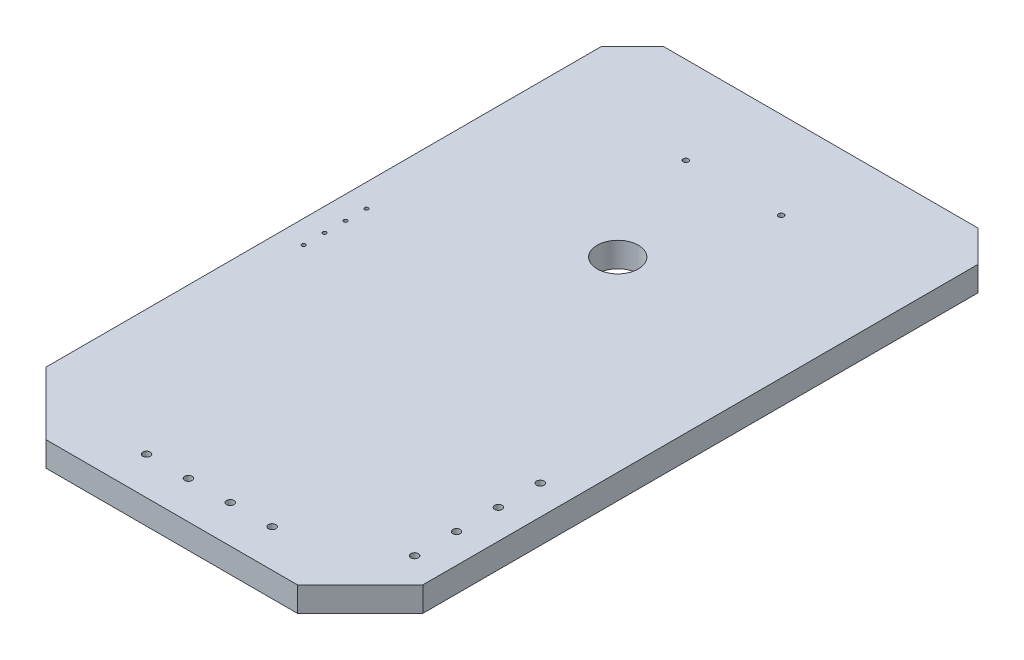
ISO-10303-21;
HEADER;
FILE_DESCRIPTION(('STEP AP214'),'2;1');
FILE_NAME('part.step','',(''),(''),'','','');
FILE_SCHEMA(('AUTOMOTIVE_DESIGN { 1 0 10303 214 1 1 1 1 }'));
ENDSEC;
DATA;
#1=APPLICATION_CONTEXT('core data for automotive mechanical design processes');
#2=APPLICATION_PROTOCOL_DEFINITION('international standard','automotive_design',2000,#1);
#3=PRODUCT_CONTEXT('',#1,'mechanical');
#4=PRODUCT('Part','Part','',(#3));
#5=PRODUCT_RELATED_PRODUCT_CATEGORY('part','',(#4));
#6=PRODUCT_DEFINITION_FORMATION('','',#4);
#7=PRODUCT_DEFINITION_CONTEXT('part definition',#1,'design');
#8=PRODUCT_DEFINITION('design','',#6,#7);
#9=PRODUCT_DEFINITION_SHAPE('','',#8);
#10=(LENGTH_UNIT() NAMED_UNIT(*) SI_UNIT(.MILLI.,.METRE.));
#11=(NAMED_UNIT(*) PLANE_ANGLE_UNIT() SI_UNIT($,.RADIAN.));
#12=(NAMED_UNIT(*) SI_UNIT($,.STERADIAN.) SOLID_ANGLE_UNIT());
#13=UNCERTAINTY_MEASURE_WITH_UNIT(LENGTH_MEASURE(1.E-05),#10,'distance_accuracy_value','');
#14=(GEOMETRIC_REPRESENTATION_CONTEXT(3) GLOBAL_UNCERTAINTY_ASSIGNED_CONTEXT((#13)) GLOBAL_UNIT_ASSIGNED_CONTEXT((#10,
#11,#12)) REPRESENTATION_CONTEXT('',''));
#15=CARTESIAN_POINT('',(0.,0.,0.));
#16=DIRECTION('',(0.,0.,1.));
#17=DIRECTION('',(1.,0.,0.));
#18=AXIS2_PLACEMENT_3D('',#15,#16,#17);
#19=CARTESIAN_POINT('',(0.,1.5,0.));
#20=DIRECTION('',(0.,1.,0.));
#21=DIRECTION('',(0.,0.,1.));
#22=AXIS2_PLACEMENT_3D('',#19,#20,#21);
#23=PLANE('',#22);
#24=CARTESIAN_POINT('',(129.667,1.5,-82.804));
#25=DIRECTION('',(0.,1.,0.));
#26=DIRECTION('',(0.,0.,1.));
#27=AXIS2_PLACEMENT_3D('',#24,#25,#26);
#28=CIRCLE('',#27,1.25000000000001);
#29=CARTESIAN_POINT('',(129.667,1.5,-81.554));
#30=VERTEX_POINT('',#29);
#31=EDGE_CURVE('E266',#30,#30,#28,.T.);
#32=ORIENTED_EDGE('',*,*,#31,.F.);
#33=EDGE_LOOP('',(#32));
#34=FACE_BOUND('',#33,.T.);
#35=CARTESIAN_POINT('',(119.507,1.5,-73.914));
#36=DIRECTION('',(0.,1.,0.));
#37=DIRECTION('',(0.,0.,1.));
#38=AXIS2_PLACEMENT_3D('',#35,#36,#37);
#39=CIRCLE('',#38,0.112496600000012);
#40=CARTESIAN_POINT('',(119.507,1.5,-73.8015034));
#41=VERTEX_POINT('',#40);
#42=EDGE_CURVE('E251',#41,#41,#39,.T.);
#43=ORIENTED_EDGE('',*,*,#42,.F.);
#44=EDGE_LOOP('',(#43));
#45=FACE_BOUND('',#44,.T.);
#46=CARTESIAN_POINT('',(119.507,1.5,-77.724));
#47=DIRECTION('',(0.,1.,0.));
#48=DIRECTION('',(0.,0.,1.));
#49=AXIS2_PLACEMENT_3D('',#46,#47,#48);
#50=CIRCLE('',#49,0.112496600000012);
#51=CARTESIAN_POINT('',(119.507,1.5,-77.6115034));
#52=VERTEX_POINT('',#51);
#53=EDGE_CURVE('E239',#52,#52,#50,.T.);
#54=ORIENTED_EDGE('',*,*,#53,.F.);
#55=EDGE_LOOP('',(#54));
#56=FACE_BOUND('',#55,.T.);
#57=CARTESIAN_POINT('',(139.192,1.5,-63.5));
#58=DIRECTION('',(0.,1.,0.));
#59=DIRECTION('',(0.,0.,1.));
#60=AXIS2_PLACEMENT_3D('',#57,#58,#59);
#61=CIRCLE('',#60,0.224993199999968);
#62=CARTESIAN_POINT('',(139.192,1.5,-63.2750068));
#63=VERTEX_POINT('',#62);
#64=EDGE_CURVE('E227',#63,#63,#61,.T.);
#65=ORIENTED_EDGE('',*,*,#64,.F.);
#66=EDGE_LOOP('',(#65));
#67=FACE_BOUND('',#66,.T.);
#68=CARTESIAN_POINT('',(139.192,1.5,-68.58));
#69=DIRECTION('',(0.,1.,0.));
#70=DIRECTION('',(0.,0.,1.));
#71=AXIS2_PLACEMENT_3D('',#68,#69,#70);
#72=CIRCLE('',#71,0.224993199999968);
#73=CARTESIAN_POINT('',(139.192,1.5,-68.3550068));
#74=VERTEX_POINT('',#73);
#75=EDGE_CURVE('E215',#74,#74,#72,.T.);
#76=ORIENTED_EDGE('',*,*,#75,.F.);
#77=EDGE_LOOP('',(#76));
#78=FACE_BOUND('',#77,.T.);
#79=CARTESIAN_POINT('',(128.27,1.5,-58.166));
#80=DIRECTION('',(0.,1.,0.));
#81=DIRECTION('',(0.,0.,1.));
#82=AXIS2_PLACEMENT_3D('',#79,#80,#81);
#83=CIRCLE('',#82,0.224993199999995);
#84=CARTESIAN_POINT('',(128.27,1.5,-57.9410068));
#85=VERTEX_POINT('',#84);
#86=EDGE_CURVE('E203',#85,#85,#83,.T.);
#87=ORIENTED_EDGE('',*,*,#86,.F.);
#88=EDGE_LOOP('',(#87));
#89=FACE_BOUND('',#88,.T.);
#90=CARTESIAN_POINT('',(133.35,1.5,-58.166));
#91=DIRECTION('',(0.,1.,0.));
#92=DIRECTION('',(0.,0.,1.));
#93=AXIS2_PLACEMENT_3D('',#90,#91,#92);
#94=CIRCLE('',#93,0.224993199999995);
#95=CARTESIAN_POINT('',(133.35,1.5,-57.9410068));
#96=VERTEX_POINT('',#95);
#97=EDGE_CURVE('E191',#96,#96,#94,.T.);
#98=ORIENTED_EDGE('',*,*,#97,.F.);
#99=EDGE_LOOP('',(#98));
#100=FACE_BOUND('',#99,.T.);
#101=CARTESIAN_POINT('',(126.65202,1.5,-89.94902));
#102=DIRECTION('',(0.,1.,0.));
#103=DIRECTION('',(0.,0.,1.));
#104=AXIS2_PLACEMENT_3D('',#101,#102,#103);
#105=CIRCLE('',#104,0.162509199999994);
#106=CARTESIAN_POINT('',(126.65202,1.5,-89.7865108));
#107=VERTEX_POINT('',#106);
#108=EDGE_CURVE('E137',#107,#107,#105,.T.);
#109=ORIENTED_EDGE('',*,*,#108,.F.);
#110=EDGE_LOOP('',(#109));
#111=FACE_BOUND('',#110,.T.);
#112=DIRECTION('',(-0.707106781186545,0.,0.70710678118655));
#113=VECTOR('',#112,1.);
#114=CARTESIAN_POINT('',(120.015,1.5,-95.25));
#115=LINE('',#114,#113);
#116=CARTESIAN_POINT('',(120.015,1.5,-95.25));
#117=VERTEX_POINT('',#116);
#118=CARTESIAN_POINT('',(118.11,1.5,-93.345));
#119=VERTEX_POINT('',#118);
#120=EDGE_CURVE('E148',#117,#119,#115,.T.);
#121=ORIENTED_EDGE('',*,*,#120,.T.);
#122=DIRECTION('',(0.,0.,1.));
#123=VECTOR('',#122,1.);
#124=CARTESIAN_POINT('',(118.11,1.5,-59.69));
#125=LINE('',#124,#123);
#126=CARTESIAN_POINT('',(118.11,1.5,-59.69));
#127=VERTEX_POINT('',#126);
#128=EDGE_CURVE('E96',#119,#127,#125,.T.);
#129=ORIENTED_EDGE('',*,*,#128,.T.);
#130=DIRECTION('',(0.707106781186546,0.,0.707106781186549));
#131=VECTOR('',#130,1.);
#132=CARTESIAN_POINT('',(118.11,1.5,-59.69));
#133=LINE('',#132,#131);
#134=CARTESIAN_POINT('',(121.92,1.5,-55.88));
#135=VERTEX_POINT('',#134);
#136=EDGE_CURVE('E163',#127,#135,#133,.T.);
#137=ORIENTED_EDGE('',*,*,#136,.T.);
#138=DIRECTION('',(1.,0.,0.));
#139=VECTOR('',#138,1.);
#140=CARTESIAN_POINT('',(121.92,1.5,-55.88));
#141=LINE('',#140,#139);
#142=CARTESIAN_POINT('',(137.16,1.5,-55.88));
#143=VERTEX_POINT('',#142);
#144=EDGE_CURVE('E176',#135,#143,#141,.T.);
#145=ORIENTED_EDGE('',*,*,#144,.T.);
#146=DIRECTION('',(0.707106781186546,0.,-0.707106781186549));
#147=VECTOR('',#146,1.);
#148=CARTESIAN_POINT('',(137.16,1.5,-55.88));
#149=LINE('',#148,#147);
#150=CARTESIAN_POINT('',(140.97,1.5,-59.69));
#151=VERTEX_POINT('',#150);
#152=EDGE_CURVE('E115',#143,#151,#149,.T.);
#153=ORIENTED_EDGE('',*,*,#152,.T.);
#154=DIRECTION('',(0.,0.,-1.));
#155=VECTOR('',#154,1.);
#156=CARTESIAN_POINT('',(140.97,1.5,-59.69));
#157=LINE('',#156,#155);
#158=CARTESIAN_POINT('',(140.97,1.5,-93.345));
#159=VERTEX_POINT('',#158);
#160=EDGE_CURVE('E109',#151,#159,#157,.T.);
#161=ORIENTED_EDGE('',*,*,#160,.T.);
#162=DIRECTION('',(-0.707106781186545,0.,-0.70710678118655));
#163=VECTOR('',#162,1.);
#164=CARTESIAN_POINT('',(139.065,1.5,-95.25));
#165=LINE('',#164,#163);
#166=CARTESIAN_POINT('',(139.065,1.5,-95.25));
#167=VERTEX_POINT('',#166);
#168=EDGE_CURVE('E113',#159,#167,#165,.T.);
#169=ORIENTED_EDGE('',*,*,#168,.T.);
#170=DIRECTION('',(-1.,0.,0.));
#171=VECTOR('',#170,1.);
#172=CARTESIAN_POINT('',(139.065,1.5,-95.25));
#173=LINE('',#172,#171);
#174=EDGE_CURVE('E53',#167,#117,#173,.T.);
#175=ORIENTED_EDGE('',*,*,#174,.T.);
#176=EDGE_LOOP('',(#121,#129,#137,#145,#153,#161,#169,#175));
#177=FACE_BOUND('',#176,.T.);
#178=CARTESIAN_POINT('',(132.42798,1.5,-89.94902));
#179=DIRECTION('',(0.,1.,0.));
#180=DIRECTION('',(0.,0.,1.));
#181=AXIS2_PLACEMENT_3D('',#178,#179,#180);
#182=CIRCLE('',#181,0.162509199999994);
#183=CARTESIAN_POINT('',(132.42798,1.5,-89.7865108));
#184=VERTEX_POINT('',#183);
#185=EDGE_CURVE('E185',#184,#184,#182,.T.);
#186=ORIENTED_EDGE('',*,*,#185,.F.);
#187=EDGE_LOOP('',(#186));
#188=FACE_BOUND('',#187,.T.);
#189=CARTESIAN_POINT('',(130.81,1.5,-58.166));
#190=DIRECTION('',(0.,1.,0.));
#191=DIRECTION('',(0.,0.,1.));
#192=AXIS2_PLACEMENT_3D('',#189,#190,#191);
#193=CIRCLE('',#192,0.224993199999995);
#194=CARTESIAN_POINT('',(130.81,1.5,-57.9410068));
#195=VERTEX_POINT('',#194);
#196=EDGE_CURVE('E197',#195,#195,#193,.T.);
#197=ORIENTED_EDGE('',*,*,#196,.F.);
#198=EDGE_LOOP('',(#197));
#199=FACE_BOUND('',#198,.T.);
#200=CARTESIAN_POINT('',(125.73,1.5,-58.166));
#201=DIRECTION('',(0.,1.,0.));
#202=DIRECTION('',(0.,0.,1.));
#203=AXIS2_PLACEMENT_3D('',#200,#201,#202);
#204=CIRCLE('',#203,0.224993200000023);
#205=CARTESIAN_POINT('',(125.73,1.5,-57.9410068));
#206=VERTEX_POINT('',#205);
#207=EDGE_CURVE('E209',#206,#206,#204,.T.);
#208=ORIENTED_EDGE('',*,*,#207,.F.);
#209=EDGE_LOOP('',(#208));
#210=FACE_BOUND('',#209,.T.);
#211=CARTESIAN_POINT('',(139.192,1.5,-66.04));
#212=DIRECTION('',(0.,1.,0.));
#213=DIRECTION('',(0.,0.,1.));
#214=AXIS2_PLACEMENT_3D('',#211,#212,#213);
#215=CIRCLE('',#214,0.224993199999968);
#216=CARTESIAN_POINT('',(139.192,1.5,-65.8150068));
#217=VERTEX_POINT('',#216);
#218=EDGE_CURVE('E221',#217,#217,#215,.T.);
#219=ORIENTED_EDGE('',*,*,#218,.F.);
#220=EDGE_LOOP('',(#219));
#221=FACE_BOUND('',#220,.T.);
#222=CARTESIAN_POINT('',(139.192,1.5,-60.96));
#223=DIRECTION('',(0.,1.,0.));
#224=DIRECTION('',(0.,0.,1.));
#225=AXIS2_PLACEMENT_3D('',#222,#223,#224);
#226=CIRCLE('',#225,0.224993199999968);
#227=CARTESIAN_POINT('',(139.192,1.5,-60.7350068));
#228=VERTEX_POINT('',#227);
#229=EDGE_CURVE('E233',#228,#228,#226,.T.);
#230=ORIENTED_EDGE('',*,*,#229,.F.);
#231=EDGE_LOOP('',(#230));
#232=FACE_BOUND('',#231,.T.);
#233=CARTESIAN_POINT('',(119.507,1.5,-76.454));
#234=DIRECTION('',(0.,1.,0.));
#235=DIRECTION('',(0.,0.,1.));
#236=AXIS2_PLACEMENT_3D('',#233,#234,#235);
#237=CIRCLE('',#236,0.112496600000012);
#238=CARTESIAN_POINT('',(119.507,1.5,-76.3415034));
#239=VERTEX_POINT('',#238);
#240=EDGE_CURVE('E245',#239,#239,#237,.T.);
#241=ORIENTED_EDGE('',*,*,#240,.F.);
#242=EDGE_LOOP('',(#241));
#243=FACE_BOUND('',#242,.T.);
#244=CARTESIAN_POINT('',(119.507,1.5,-75.184));
#245=DIRECTION('',(0.,1.,0.));
#246=DIRECTION('',(0.,0.,1.));
#247=AXIS2_PLACEMENT_3D('',#244,#245,#246);
#248=CIRCLE('',#247,0.112496600000012);
#249=CARTESIAN_POINT('',(119.507,1.5,-75.0715034));
#250=VERTEX_POINT('',#249);
#251=EDGE_CURVE('E257',#250,#250,#248,.T.);
#252=ORIENTED_EDGE('',*,*,#251,.F.);
#253=EDGE_LOOP('',(#252));
#254=FACE_BOUND('',#253,.T.);
#255=ADVANCED_FACE('F36',(#34,#45,#56,#67,#78,#89,#100,#111,#177,#188,#199,#210,#221,#232,#243,
#254),#23,.T.);
#256=CARTESIAN_POINT('',(0.,0.,0.));
#257=DIRECTION('',(0.,1.,0.));
#258=DIRECTION('',(0.,0.,1.));
#259=AXIS2_PLACEMENT_3D('',#256,#257,#258);
#260=PLANE('',#259);
#261=CARTESIAN_POINT('',(129.667,0.,-82.804));
#262=DIRECTION('',(0.,1.,0.));
#263=DIRECTION('',(0.,0.,1.));
#264=AXIS2_PLACEMENT_3D('',#261,#262,#263);
#265=CIRCLE('',#264,1.25000000000001);
#266=CARTESIAN_POINT('',(129.667,0.,-81.554));
#267=VERTEX_POINT('',#266);
#268=EDGE_CURVE('E263',#267,#267,#265,.T.);
#269=ORIENTED_EDGE('',*,*,#268,.T.);
#270=EDGE_LOOP('',(#269));
#271=FACE_BOUND('',#270,.T.);
#272=DIRECTION('',(-0.707106781186545,0.,0.70710678118655));
#273=VECTOR('',#272,1.);
#274=CARTESIAN_POINT('',(120.015,0.,-95.25));
#275=LINE('',#274,#273);
#276=CARTESIAN_POINT('',(120.015,0.,-95.25));
#277=VERTEX_POINT('',#276);
#278=CARTESIAN_POINT('',(118.11,0.,-93.345));
#279=VERTEX_POINT('',#278);
#280=EDGE_CURVE('E133',#277,#279,#275,.T.);
#281=ORIENTED_EDGE('',*,*,#280,.F.);
#282=DIRECTION('',(-1.,0.,0.));
#283=VECTOR('',#282,1.);
#284=CARTESIAN_POINT('',(139.065,0.,-95.25));
#285=LINE('',#284,#283);
#286=CARTESIAN_POINT('',(139.065,0.,-95.25));
#287=VERTEX_POINT('',#286);
#288=EDGE_CURVE('E88',#287,#277,#285,.T.);
#289=ORIENTED_EDGE('',*,*,#288,.F.);
#290=DIRECTION('',(-0.707106781186545,0.,-0.70710678118655));
#291=VECTOR('',#290,1.);
#292=CARTESIAN_POINT('',(139.065,0.,-95.25));
#293=LINE('',#292,#291);
#294=CARTESIAN_POINT('',(140.97,0.,-93.345));
#295=VERTEX_POINT('',#294);
#296=EDGE_CURVE('E82',#295,#287,#293,.T.);
#297=ORIENTED_EDGE('',*,*,#296,.F.);
#298=DIRECTION('',(0.,0.,-1.));
#299=VECTOR('',#298,1.);
#300=CARTESIAN_POINT('',(140.97,0.,-59.69));
#301=LINE('',#300,#299);
#302=CARTESIAN_POINT('',(140.97,0.,-59.69));
#303=VERTEX_POINT('',#302);
#304=EDGE_CURVE('E123',#303,#295,#301,.T.);
#305=ORIENTED_EDGE('',*,*,#304,.F.);
#306=DIRECTION('',(0.707106781186546,0.,-0.707106781186549));
#307=VECTOR('',#306,1.);
#308=CARTESIAN_POINT('',(137.16,0.,-55.88));
#309=LINE('',#308,#307);
#310=CARTESIAN_POINT('',(137.16,0.,-55.88));
#311=VERTEX_POINT('',#310);
#312=EDGE_CURVE('E143',#311,#303,#309,.T.);
#313=ORIENTED_EDGE('',*,*,#312,.F.);
#314=DIRECTION('',(1.,0.,0.));
#315=VECTOR('',#314,1.);
#316=CARTESIAN_POINT('',(121.92,0.,-55.88));
#317=LINE('',#316,#315);
#318=CARTESIAN_POINT('',(121.92,0.,-55.88));
#319=VERTEX_POINT('',#318);
#320=EDGE_CURVE('E141',#319,#311,#317,.T.);
#321=ORIENTED_EDGE('',*,*,#320,.F.);
#322=DIRECTION('',(0.707106781186546,0.,0.707106781186549));
#323=VECTOR('',#322,1.);
#324=CARTESIAN_POINT('',(118.11,0.,-59.69));
#325=LINE('',#324,#323);
#326=CARTESIAN_POINT('',(118.11,0.,-59.69));
#327=VERTEX_POINT('',#326);
#328=EDGE_CURVE('E139',#327,#319,#325,.T.);
#329=ORIENTED_EDGE('',*,*,#328,.F.);
#330=DIRECTION('',(0.,0.,1.));
#331=VECTOR('',#330,1.);
#332=CARTESIAN_POINT('',(118.11,0.,-59.69));
#333=LINE('',#332,#331);
#334=EDGE_CURVE('E136',#279,#327,#333,.T.);
#335=ORIENTED_EDGE('',*,*,#334,.F.);
#336=EDGE_LOOP('',(#281,#289,#297,#305,#313,#321,#329,#335));
#337=FACE_BOUND('',#336,.T.);
#338=CARTESIAN_POINT('',(126.65202,0.,-89.94902));
#339=DIRECTION('',(0.,1.,0.));
#340=DIRECTION('',(0.,0.,1.));
#341=AXIS2_PLACEMENT_3D('',#338,#339,#340);
#342=CIRCLE('',#341,0.162509199999994);
#343=CARTESIAN_POINT('',(126.65202,0.,-89.7865108));
#344=VERTEX_POINT('',#343);
#345=EDGE_CURVE('E182',#344,#344,#342,.T.);
#346=ORIENTED_EDGE('',*,*,#345,.T.);
#347=EDGE_LOOP('',(#346));
#348=FACE_BOUND('',#347,.T.);
#349=CARTESIAN_POINT('',(132.42798,0.,-89.94902));
#350=DIRECTION('',(0.,1.,0.));
#351=DIRECTION('',(0.,0.,1.));
#352=AXIS2_PLACEMENT_3D('',#349,#350,#351);
#353=CIRCLE('',#352,0.162509199999994);
#354=CARTESIAN_POINT('',(132.42798,0.,-89.7865108));
#355=VERTEX_POINT('',#354);
#356=EDGE_CURVE('E188',#355,#355,#353,.T.);
#357=ORIENTED_EDGE('',*,*,#356,.T.);
#358=EDGE_LOOP('',(#357));
#359=FACE_BOUND('',#358,.T.);
#360=CARTESIAN_POINT('',(133.35,0.,-58.166));
#361=DIRECTION('',(0.,1.,0.));
#362=DIRECTION('',(0.,0.,1.));
#363=AXIS2_PLACEMENT_3D('',#360,#361,#362);
#364=CIRCLE('',#363,0.224993199999995);
#365=CARTESIAN_POINT('',(133.35,0.,-57.9410068));
#366=VERTEX_POINT('',#365);
#367=EDGE_CURVE('E194',#366,#366,#364,.T.);
#368=ORIENTED_EDGE('',*,*,#367,.T.);
#369=EDGE_LOOP('',(#368));
#370=FACE_BOUND('',#369,.T.);
#371=CARTESIAN_POINT('',(130.81,0.,-58.166));
#372=DIRECTION('',(0.,1.,0.));
#373=DIRECTION('',(0.,0.,1.));
#374=AXIS2_PLACEMENT_3D('',#371,#372,#373);
#375=CIRCLE('',#374,0.224993199999995);
#376=CARTESIAN_POINT('',(130.81,0.,-57.9410068));
#377=VERTEX_POINT('',#376);
#378=EDGE_CURVE('E200',#377,#377,#375,.T.);
#379=ORIENTED_EDGE('',*,*,#378,.T.);
#380=EDGE_LOOP('',(#379));
#381=FACE_BOUND('',#380,.T.);
#382=CARTESIAN_POINT('',(128.27,0.,-58.166));
#383=DIRECTION('',(0.,1.,0.));
#384=DIRECTION('',(0.,0.,1.));
#385=AXIS2_PLACEMENT_3D('',#382,#383,#384);
#386=CIRCLE('',#385,0.224993199999995);
#387=CARTESIAN_POINT('',(128.27,0.,-57.9410068));
#388=VERTEX_POINT('',#387);
#389=EDGE_CURVE('E206',#388,#388,#386,.T.);
#390=ORIENTED_EDGE('',*,*,#389,.T.);
#391=EDGE_LOOP('',(#390));
#392=FACE_BOUND('',#391,.T.);
#393=CARTESIAN_POINT('',(125.73,0.,-58.166));
#394=DIRECTION('',(0.,1.,0.));
#395=DIRECTION('',(0.,0.,1.));
#396=AXIS2_PLACEMENT_3D('',#393,#394,#395);
#397=CIRCLE('',#396,0.224993200000023);
#398=CARTESIAN_POINT('',(125.73,0.,-57.9410068));
#399=VERTEX_POINT('',#398);
#400=EDGE_CURVE('E212',#399,#399,#397,.T.);
#401=ORIENTED_EDGE('',*,*,#400,.T.);
#402=EDGE_LOOP('',(#401));
#403=FACE_BOUND('',#402,.T.);
#404=CARTESIAN_POINT('',(139.192,0.,-68.58));
#405=DIRECTION('',(0.,1.,0.));
#406=DIRECTION('',(0.,0.,1.));
#407=AXIS2_PLACEMENT_3D('',#404,#405,#406);
#408=CIRCLE('',#407,0.224993199999968);
#409=CARTESIAN_POINT('',(139.192,0.,-68.3550068));
#410=VERTEX_POINT('',#409);
#411=EDGE_CURVE('E218',#410,#410,#408,.T.);
#412=ORIENTED_EDGE('',*,*,#411,.T.);
#413=EDGE_LOOP('',(#412));
#414=FACE_BOUND('',#413,.T.);
#415=CARTESIAN_POINT('',(139.192,0.,-66.04));
#416=DIRECTION('',(0.,1.,0.));
#417=DIRECTION('',(0.,0.,1.));
#418=AXIS2_PLACEMENT_3D('',#415,#416,#417);
#419=CIRCLE('',#418,0.224993199999968);
#420=CARTESIAN_POINT('',(139.192,0.,-65.8150068));
#421=VERTEX_POINT('',#420);
#422=EDGE_CURVE('E224',#421,#421,#419,.T.);
#423=ORIENTED_EDGE('',*,*,#422,.T.);
#424=EDGE_LOOP('',(#423));
#425=FACE_BOUND('',#424,.T.);
#426=CARTESIAN_POINT('',(139.192,0.,-63.5));
#427=DIRECTION('',(0.,1.,0.));
#428=DIRECTION('',(0.,0.,1.));
#429=AXIS2_PLACEMENT_3D('',#426,#427,#428);
#430=CIRCLE('',#429,0.224993199999968);
#431=CARTESIAN_POINT('',(139.192,0.,-63.2750068));
#432=VERTEX_POINT('',#431);
#433=EDGE_CURVE('E230',#432,#432,#430,.T.);
#434=ORIENTED_EDGE('',*,*,#433,.T.);
#435=EDGE_LOOP('',(#434));
#436=FACE_BOUND('',#435,.T.);
#437=CARTESIAN_POINT('',(139.192,0.,-60.96));
#438=DIRECTION('',(0.,1.,0.));
#439=DIRECTION('',(0.,0.,1.));
#440=AXIS2_PLACEMENT_3D('',#437,#438,#439);
#441=CIRCLE('',#440,0.224993199999968);
#442=CARTESIAN_POINT('',(139.192,0.,-60.7350068));
#443=VERTEX_POINT('',#442);
#444=EDGE_CURVE('E236',#443,#443,#441,.T.);
#445=ORIENTED_EDGE('',*,*,#444,.T.);
#446=EDGE_LOOP('',(#445));
#447=FACE_BOUND('',#446,.T.);
#448=CARTESIAN_POINT('',(119.507,0.,-77.724));
#449=DIRECTION('',(0.,1.,0.));
#450=DIRECTION('',(0.,0.,1.));
#451=AXIS2_PLACEMENT_3D('',#448,#449,#450);
#452=CIRCLE('',#451,0.112496600000012);
#453=CARTESIAN_POINT('',(119.507,0.,-77.6115034));
#454=VERTEX_POINT('',#453);
#455=EDGE_CURVE('E242',#454,#454,#452,.T.);
#456=ORIENTED_EDGE('',*,*,#455,.T.);
#457=EDGE_LOOP('',(#456));
#458=FACE_BOUND('',#457,.T.);
#459=CARTESIAN_POINT('',(119.507,0.,-76.454));
#460=DIRECTION('',(0.,1.,0.));
#461=DIRECTION('',(0.,0.,1.));
#462=AXIS2_PLACEMENT_3D('',#459,#460,#461);
#463=CIRCLE('',#462,0.112496600000012);
#464=CARTESIAN_POINT('',(119.507,0.,-76.3415034));
#465=VERTEX_POINT('',#464);
#466=EDGE_CURVE('E248',#465,#465,#463,.T.);
#467=ORIENTED_EDGE('',*,*,#466,.T.);
#468=EDGE_LOOP('',(#467));
#469=FACE_BOUND('',#468,.T.);
#470=CARTESIAN_POINT('',(119.507,0.,-73.914));
#471=DIRECTION('',(0.,1.,0.));
#472=DIRECTION('',(0.,0.,1.));
#473=AXIS2_PLACEMENT_3D('',#470,#471,#472);
#474=CIRCLE('',#473,0.112496600000012);
#475=CARTESIAN_POINT('',(119.507,0.,-73.8015034));
#476=VERTEX_POINT('',#475);
#477=EDGE_CURVE('E254',#476,#476,#474,.T.);
#478=ORIENTED_EDGE('',*,*,#477,.T.);
#479=EDGE_LOOP('',(#478));
#480=FACE_BOUND('',#479,.T.);
#481=CARTESIAN_POINT('',(119.507,0.,-75.184));
#482=DIRECTION('',(0.,1.,0.));
#483=DIRECTION('',(0.,0.,1.));
#484=AXIS2_PLACEMENT_3D('',#481,#482,#483);
#485=CIRCLE('',#484,0.112496600000012);
#486=CARTESIAN_POINT('',(119.507,0.,-75.0715034));
#487=VERTEX_POINT('',#486);
#488=EDGE_CURVE('E260',#487,#487,#485,.T.);
#489=ORIENTED_EDGE('',*,*,#488,.T.);
#490=EDGE_LOOP('',(#489));
#491=FACE_BOUND('',#490,.T.);
#492=ADVANCED_FACE('F167',(#271,#337,#348,#359,#370,#381,#392,#403,#414,#425,#436,#447,#458,
#469,#480,#491),#260,.F.);
#493=CARTESIAN_POINT('',(120.015,1.5,-95.25));
#494=DIRECTION('',(0.70710678118655,0.,0.707106781186545));
#495=DIRECTION('',(0.707106781186545,0.,-0.70710678118655));
#496=AXIS2_PLACEMENT_3D('',#493,#494,#495);
#497=PLANE('',#496);
#498=ORIENTED_EDGE('',*,*,#280,.T.);
#499=DIRECTION('',(0.,-1.,0.));
#500=VECTOR('',#499,1.);
#501=CARTESIAN_POINT('',(118.11,1.5,-93.345));
#502=LINE('',#501,#500);
#503=EDGE_CURVE('E11',#119,#279,#502,.T.);
#504=ORIENTED_EDGE('',*,*,#503,.F.);
#505=ORIENTED_EDGE('',*,*,#120,.F.);
#506=DIRECTION('',(0.,-1.,0.));
#507=VECTOR('',#506,1.);
#508=CARTESIAN_POINT('',(120.015,1.5,-95.25));
#509=LINE('',#508,#507);
#510=EDGE_CURVE('E129',#117,#277,#509,.T.);
#511=ORIENTED_EDGE('',*,*,#510,.T.);
#512=EDGE_LOOP('',(#498,#504,#505,#511));
#513=FACE_BOUND('',#512,.T.);
#514=ADVANCED_FACE('F38',(#513),#497,.F.);
#515=CARTESIAN_POINT('',(118.11,1.5,-59.69));
#516=DIRECTION('',(1.,0.,0.));
#517=DIRECTION('',(0.,0.,-1.));
#518=AXIS2_PLACEMENT_3D('',#515,#516,#517);
#519=PLANE('',#518);
#520=ORIENTED_EDGE('',*,*,#334,.T.);
#521=DIRECTION('',(0.,-1.,0.));
#522=VECTOR('',#521,1.);
#523=CARTESIAN_POINT('',(118.11,1.5,-59.69));
#524=LINE('',#523,#522);
#525=EDGE_CURVE('E45',#127,#327,#524,.T.);
#526=ORIENTED_EDGE('',*,*,#525,.F.);
#527=ORIENTED_EDGE('',*,*,#128,.F.);
#528=ORIENTED_EDGE('',*,*,#503,.T.);
#529=EDGE_LOOP('',(#520,#526,#527,#528));
#530=FACE_BOUND('',#529,.T.);
#531=ADVANCED_FACE('F397',(#530),#519,.F.);
#532=CARTESIAN_POINT('',(118.11,1.5,-59.69));
#533=DIRECTION('',(0.707106781186549,0.,-0.707106781186545));
#534=DIRECTION('',(-0.707106781186546,0.,-0.707106781186549));
#535=AXIS2_PLACEMENT_3D('',#532,#533,#534);
#536=PLANE('',#535);
#537=ORIENTED_EDGE('',*,*,#328,.T.);
#538=DIRECTION('',(0.,-1.,0.));
#539=VECTOR('',#538,1.);
#540=CARTESIAN_POINT('',(121.92,1.5,-55.88));
#541=LINE('',#540,#539);
#542=EDGE_CURVE('E155',#135,#319,#541,.T.);
#543=ORIENTED_EDGE('',*,*,#542,.F.);
#544=ORIENTED_EDGE('',*,*,#136,.F.);
#545=ORIENTED_EDGE('',*,*,#525,.T.);
#546=EDGE_LOOP('',(#537,#543,#544,#545));
#547=FACE_BOUND('',#546,.T.);
#548=ADVANCED_FACE('F161',(#547),#536,.F.);
#549=CARTESIAN_POINT('',(121.92,1.5,-55.88));
#550=DIRECTION('',(0.,0.,-1.));
#551=DIRECTION('',(-1.,0.,0.));
#552=AXIS2_PLACEMENT_3D('',#549,#550,#551);
#553=PLANE('',#552);
#554=ORIENTED_EDGE('',*,*,#320,.T.);
#555=DIRECTION('',(0.,-1.,0.));
#556=VECTOR('',#555,1.);
#557=CARTESIAN_POINT('',(137.16,1.5,-55.88));
#558=LINE('',#557,#556);
#559=EDGE_CURVE('E152',#143,#311,#558,.T.);
#560=ORIENTED_EDGE('',*,*,#559,.F.);
#561=ORIENTED_EDGE('',*,*,#144,.F.);
#562=ORIENTED_EDGE('',*,*,#542,.T.);
#563=EDGE_LOOP('',(#554,#560,#561,#562));
#564=FACE_BOUND('',#563,.T.);
#565=ADVANCED_FACE('F172',(#564),#553,.F.);
#566=CARTESIAN_POINT('',(137.16,1.5,-55.88));
#567=DIRECTION('',(-0.707106781186549,0.,-0.707106781186545));
#568=DIRECTION('',(-0.707106781186546,0.,0.707106781186549));
#569=AXIS2_PLACEMENT_3D('',#566,#567,#568);
#570=PLANE('',#569);
#571=ORIENTED_EDGE('',*,*,#312,.T.);
#572=DIRECTION('',(0.,-1.,0.));
#573=VECTOR('',#572,1.);
#574=CARTESIAN_POINT('',(140.97,1.5,-59.69));
#575=LINE('',#574,#573);
#576=EDGE_CURVE('E124',#151,#303,#575,.T.);
#577=ORIENTED_EDGE('',*,*,#576,.F.);
#578=ORIENTED_EDGE('',*,*,#152,.F.);
#579=ORIENTED_EDGE('',*,*,#559,.T.);
#580=EDGE_LOOP('',(#571,#577,#578,#579));
#581=FACE_BOUND('',#580,.T.);
#582=ADVANCED_FACE('F175',(#581),#570,.F.);
#583=CARTESIAN_POINT('',(140.97,1.5,-59.69));
#584=DIRECTION('',(-1.,0.,0.));
#585=DIRECTION('',(0.,0.,1.));
#586=AXIS2_PLACEMENT_3D('',#583,#584,#585);
#587=PLANE('',#586);
#588=ORIENTED_EDGE('',*,*,#304,.T.);
#589=DIRECTION('',(0.,-1.,0.));
#590=VECTOR('',#589,1.);
#591=CARTESIAN_POINT('',(140.97,1.5,-93.345));
#592=LINE('',#591,#590);
#593=EDGE_CURVE('E120',#159,#295,#592,.T.);
#594=ORIENTED_EDGE('',*,*,#593,.F.);
#595=ORIENTED_EDGE('',*,*,#160,.F.);
#596=ORIENTED_EDGE('',*,*,#576,.T.);
#597=EDGE_LOOP('',(#588,#594,#595,#596));
#598=FACE_BOUND('',#597,.T.);
#599=ADVANCED_FACE('F121',(#598),#587,.F.);
#600=CARTESIAN_POINT('',(139.065,1.5,-95.25));
#601=DIRECTION('',(-0.70710678118655,0.,0.707106781186545));
#602=DIRECTION('',(0.707106781186545,0.,0.70710678118655));
#603=AXIS2_PLACEMENT_3D('',#600,#601,#602);
#604=PLANE('',#603);
#605=ORIENTED_EDGE('',*,*,#296,.T.);
#606=DIRECTION('',(0.,-1.,0.));
#607=VECTOR('',#606,1.);
#608=CARTESIAN_POINT('',(139.065,1.5,-95.25));
#609=LINE('',#608,#607);
#610=EDGE_CURVE('E125',#167,#287,#609,.T.);
#611=ORIENTED_EDGE('',*,*,#610,.F.);
#612=ORIENTED_EDGE('',*,*,#168,.F.);
#613=ORIENTED_EDGE('',*,*,#593,.T.);
#614=EDGE_LOOP('',(#605,#611,#612,#613));
#615=FACE_BOUND('',#614,.T.);
#616=ADVANCED_FACE('F127',(#615),#604,.F.);
#617=CARTESIAN_POINT('',(139.065,1.5,-95.25));
#618=DIRECTION('',(0.,0.,1.));
#619=DIRECTION('',(1.,0.,0.));
#620=AXIS2_PLACEMENT_3D('',#617,#618,#619);
#621=PLANE('',#620);
#622=ORIENTED_EDGE('',*,*,#288,.T.);
#623=ORIENTED_EDGE('',*,*,#510,.F.);
#624=ORIENTED_EDGE('',*,*,#174,.F.);
#625=ORIENTED_EDGE('',*,*,#610,.T.);
#626=EDGE_LOOP('',(#622,#623,#624,#625));
#627=FACE_BOUND('',#626,.T.);
#628=ADVANCED_FACE('F301',(#627),#621,.F.);
#629=CARTESIAN_POINT('',(126.65202,1.5,-89.94902));
#630=DIRECTION('',(0.,-1.,0.));
#631=DIRECTION('',(0.,0.,-1.));
#632=AXIS2_PLACEMENT_3D('',#629,#630,#631);
#633=CYLINDRICAL_SURFACE('',#632,0.162509199999994);
#634=ORIENTED_EDGE('',*,*,#108,.T.);
#635=EDGE_LOOP('',(#634));
#636=FACE_BOUND('',#635,.T.);
#637=ORIENTED_EDGE('',*,*,#345,.F.);
#638=EDGE_LOOP('',(#637));
#639=FACE_BOUND('',#638,.T.);
#640=ADVANCED_FACE('F297',(#636,#639),#633,.F.);
#641=CARTESIAN_POINT('',(132.42798,1.5,-89.94902));
#642=DIRECTION('',(0.,-1.,0.));
#643=DIRECTION('',(0.,0.,-1.));
#644=AXIS2_PLACEMENT_3D('',#641,#642,#643);
#645=CYLINDRICAL_SURFACE('',#644,0.162509199999994);
#646=ORIENTED_EDGE('',*,*,#185,.T.);
#647=EDGE_LOOP('',(#646));
#648=FACE_BOUND('',#647,.T.);
#649=ORIENTED_EDGE('',*,*,#356,.F.);
#650=EDGE_LOOP('',(#649));
#651=FACE_BOUND('',#650,.T.);
#652=ADVANCED_FACE('F300',(#648,#651),#645,.F.);
#653=CARTESIAN_POINT('',(133.35,1.5,-58.166));
#654=DIRECTION('',(0.,-1.,0.));
#655=DIRECTION('',(0.,0.,-1.));
#656=AXIS2_PLACEMENT_3D('',#653,#654,#655);
#657=CYLINDRICAL_SURFACE('',#656,0.224993199999995);
#658=ORIENTED_EDGE('',*,*,#97,.T.);
#659=EDGE_LOOP('',(#658));
#660=FACE_BOUND('',#659,.T.);
#661=ORIENTED_EDGE('',*,*,#367,.F.);
#662=EDGE_LOOP('',(#661));
#663=FACE_BOUND('',#662,.T.);
#664=ADVANCED_FACE('F378',(#660,#663),#657,.F.);
#665=CARTESIAN_POINT('',(130.81,1.5,-58.166));
#666=DIRECTION('',(0.,-1.,0.));
#667=DIRECTION('',(0.,0.,-1.));
#668=AXIS2_PLACEMENT_3D('',#665,#666,#667);
#669=CYLINDRICAL_SURFACE('',#668,0.224993199999995);
#670=ORIENTED_EDGE('',*,*,#196,.T.);
#671=EDGE_LOOP('',(#670));
#672=FACE_BOUND('',#671,.T.);
#673=ORIENTED_EDGE('',*,*,#378,.F.);
#674=EDGE_LOOP('',(#673));
#675=FACE_BOUND('',#674,.T.);
#676=ADVANCED_FACE('F374',(#672,#675),#669,.F.);
#677=CARTESIAN_POINT('',(128.27,1.5,-58.166));
#678=DIRECTION('',(0.,-1.,0.));
#679=DIRECTION('',(0.,0.,-1.));
#680=AXIS2_PLACEMENT_3D('',#677,#678,#679);
#681=CYLINDRICAL_SURFACE('',#680,0.224993199999995);
#682=ORIENTED_EDGE('',*,*,#86,.T.);
#683=EDGE_LOOP('',(#682));
#684=FACE_BOUND('',#683,.T.);
#685=ORIENTED_EDGE('',*,*,#389,.F.);
#686=EDGE_LOOP('',(#685));
#687=FACE_BOUND('',#686,.T.);
#688=ADVANCED_FACE('F370',(#684,#687),#681,.F.);
#689=CARTESIAN_POINT('',(125.73,1.5,-58.166));
#690=DIRECTION('',(0.,-1.,0.));
#691=DIRECTION('',(0.,0.,-1.));
#692=AXIS2_PLACEMENT_3D('',#689,#690,#691);
#693=CYLINDRICAL_SURFACE('',#692,0.224993200000023);
#694=ORIENTED_EDGE('',*,*,#207,.T.);
#695=EDGE_LOOP('',(#694));
#696=FACE_BOUND('',#695,.T.);
#697=ORIENTED_EDGE('',*,*,#400,.F.);
#698=EDGE_LOOP('',(#697));
#699=FACE_BOUND('',#698,.T.);
#700=ADVANCED_FACE('F366',(#696,#699),#693,.F.);
#701=CARTESIAN_POINT('',(139.192,1.5,-68.58));
#702=DIRECTION('',(0.,-1.,0.));
#703=DIRECTION('',(0.,0.,-1.));
#704=AXIS2_PLACEMENT_3D('',#701,#702,#703);
#705=CYLINDRICAL_SURFACE('',#704,0.224993199999968);
#706=ORIENTED_EDGE('',*,*,#75,.T.);
#707=EDGE_LOOP('',(#706));
#708=FACE_BOUND('',#707,.T.);
#709=ORIENTED_EDGE('',*,*,#411,.F.);
#710=EDGE_LOOP('',(#709));
#711=FACE_BOUND('',#710,.T.);
#712=ADVANCED_FACE('F362',(#708,#711),#705,.F.);
#713=CARTESIAN_POINT('',(139.192,1.5,-66.04));
#714=DIRECTION('',(0.,-1.,0.));
#715=DIRECTION('',(0.,0.,-1.));
#716=AXIS2_PLACEMENT_3D('',#713,#714,#715);
#717=CYLINDRICAL_SURFACE('',#716,0.224993199999968);
#718=ORIENTED_EDGE('',*,*,#218,.T.);
#719=EDGE_LOOP('',(#718));
#720=FACE_BOUND('',#719,.T.);
#721=ORIENTED_EDGE('',*,*,#422,.F.);
#722=EDGE_LOOP('',(#721));
#723=FACE_BOUND('',#722,.T.);
#724=ADVANCED_FACE('F358',(#720,#723),#717,.F.);
#725=CARTESIAN_POINT('',(139.192,1.5,-63.5));
#726=DIRECTION('',(0.,-1.,0.));
#727=DIRECTION('',(0.,0.,-1.));
#728=AXIS2_PLACEMENT_3D('',#725,#726,#727);
#729=CYLINDRICAL_SURFACE('',#728,0.224993199999968);
#730=ORIENTED_EDGE('',*,*,#64,.T.);
#731=EDGE_LOOP('',(#730));
#732=FACE_BOUND('',#731,.T.);
#733=ORIENTED_EDGE('',*,*,#433,.F.);
#734=EDGE_LOOP('',(#733));
#735=FACE_BOUND('',#734,.T.);
#736=ADVANCED_FACE('F354',(#732,#735),#729,.F.);
#737=CARTESIAN_POINT('',(139.192,1.5,-60.96));
#738=DIRECTION('',(0.,-1.,0.));
#739=DIRECTION('',(0.,0.,-1.));
#740=AXIS2_PLACEMENT_3D('',#737,#738,#739);
#741=CYLINDRICAL_SURFACE('',#740,0.224993199999968);
#742=ORIENTED_EDGE('',*,*,#229,.T.);
#743=EDGE_LOOP('',(#742));
#744=FACE_BOUND('',#743,.T.);
#745=ORIENTED_EDGE('',*,*,#444,.F.);
#746=EDGE_LOOP('',(#745));
#747=FACE_BOUND('',#746,.T.);
#748=ADVANCED_FACE('F350',(#744,#747),#741,.F.);
#749=CARTESIAN_POINT('',(119.507,1.5,-77.724));
#750=DIRECTION('',(0.,-1.,0.));
#751=DIRECTION('',(0.,0.,-1.));
#752=AXIS2_PLACEMENT_3D('',#749,#750,#751);
#753=CYLINDRICAL_SURFACE('',#752,0.112496600000012);
#754=ORIENTED_EDGE('',*,*,#53,.T.);
#755=EDGE_LOOP('',(#754));
#756=FACE_BOUND('',#755,.T.);
#757=ORIENTED_EDGE('',*,*,#455,.F.);
#758=EDGE_LOOP('',(#757));
#759=FACE_BOUND('',#758,.T.);
#760=ADVANCED_FACE('F346',(#756,#759),#753,.F.);
#761=CARTESIAN_POINT('',(119.507,1.5,-76.454));
#762=DIRECTION('',(0.,-1.,0.));
#763=DIRECTION('',(0.,0.,-1.));
#764=AXIS2_PLACEMENT_3D('',#761,#762,#763);
#765=CYLINDRICAL_SURFACE('',#764,0.112496600000012);
#766=ORIENTED_EDGE('',*,*,#240,.T.);
#767=EDGE_LOOP('',(#766));
#768=FACE_BOUND('',#767,.T.);
#769=ORIENTED_EDGE('',*,*,#466,.F.);
#770=EDGE_LOOP('',(#769));
#771=FACE_BOUND('',#770,.T.);
#772=ADVANCED_FACE('F340',(#768,#771),#765,.F.);
#773=CARTESIAN_POINT('',(119.507,1.5,-73.914));
#774=DIRECTION('',(0.,-1.,0.));
#775=DIRECTION('',(0.,0.,-1.));
#776=AXIS2_PLACEMENT_3D('',#773,#774,#775);
#777=CYLINDRICAL_SURFACE('',#776,0.112496600000012);
#778=ORIENTED_EDGE('',*,*,#42,.T.);
#779=EDGE_LOOP('',(#778));
#780=FACE_BOUND('',#779,.T.);
#781=ORIENTED_EDGE('',*,*,#477,.F.);
#782=EDGE_LOOP('',(#781));
#783=FACE_BOUND('',#782,.T.);
#784=ADVANCED_FACE('F334',(#780,#783),#777,.F.);
#785=CARTESIAN_POINT('',(119.507,1.5,-75.184));
#786=DIRECTION('',(0.,-1.,0.));
#787=DIRECTION('',(0.,0.,-1.));
#788=AXIS2_PLACEMENT_3D('',#785,#786,#787);
#789=CYLINDRICAL_SURFACE('',#788,0.112496600000012);
#790=ORIENTED_EDGE('',*,*,#251,.T.);
#791=EDGE_LOOP('',(#790));
#792=FACE_BOUND('',#791,.T.);
#793=ORIENTED_EDGE('',*,*,#488,.F.);
#794=EDGE_LOOP('',(#793));
#795=FACE_BOUND('',#794,.T.);
#796=ADVANCED_FACE('F276',(#792,#795),#789,.F.);
#797=CARTESIAN_POINT('',(129.667,0.,-82.804));
#798=DIRECTION('',(0.,1.,0.));
#799=DIRECTION('',(0.,0.,1.));
#800=AXIS2_PLACEMENT_3D('',#797,#798,#799);
#801=CYLINDRICAL_SURFACE('',#800,1.25000000000001);
#802=ORIENTED_EDGE('',*,*,#268,.F.);
#803=EDGE_LOOP('',(#802));
#804=FACE_BOUND('',#803,.T.);
#805=ORIENTED_EDGE('',*,*,#31,.T.);
#806=EDGE_LOOP('',(#805));
#807=FACE_BOUND('',#806,.T.);
#808=ADVANCED_FACE('F273',(#804,#807),#801,.F.);
#809=CLOSED_SHELL('',(#255,#492,#514,#531,#548,#565,#582,#599,#616,#628,#640,#652,#664,#676,
#688,#700,#712,#724,#736,#748,#760,#772,#784,#796,#808));
#810=MANIFOLD_SOLID_BREP('B2',#809);
#811=ADVANCED_BREP_SHAPE_REPRESENTATION('',(#18,#810),#14);
#812=SHAPE_DEFINITION_REPRESENTATION(#9,#811);
ENDSEC;
END-ISO-10303-21;
